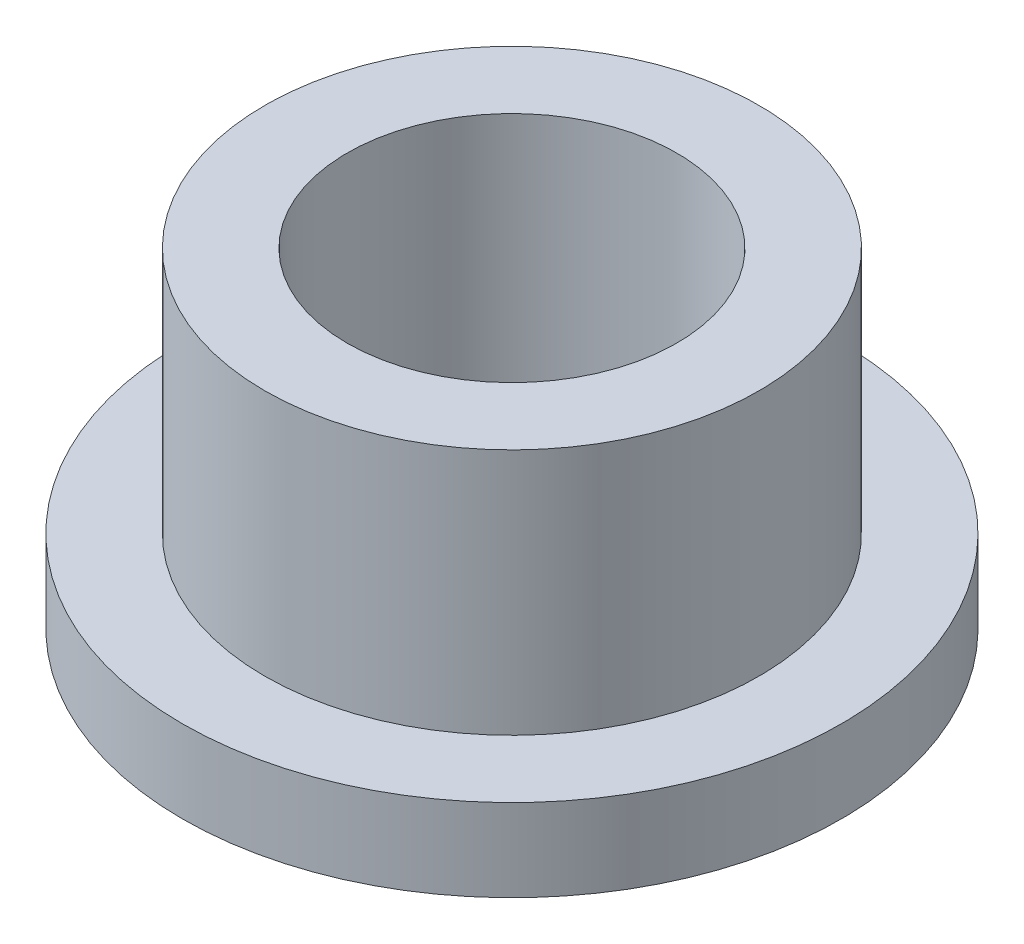
ISO-10303-21;
HEADER;
FILE_DESCRIPTION(('STEP AP214'),'2;1');
FILE_NAME('part.step','',(''),(''),'','','');
FILE_SCHEMA(('AUTOMOTIVE_DESIGN { 1 0 10303 214 1 1 1 1 }'));
ENDSEC;
DATA;
#1=APPLICATION_CONTEXT('core data for automotive mechanical design processes');
#2=APPLICATION_PROTOCOL_DEFINITION('international standard','automotive_design',2000,#1);
#3=PRODUCT_CONTEXT('',#1,'mechanical');
#4=PRODUCT('Part','Part','',(#3));
#5=PRODUCT_RELATED_PRODUCT_CATEGORY('part','',(#4));
#6=PRODUCT_DEFINITION_FORMATION('','',#4);
#7=PRODUCT_DEFINITION_CONTEXT('part definition',#1,'design');
#8=PRODUCT_DEFINITION('design','',#6,#7);
#9=PRODUCT_DEFINITION_SHAPE('','',#8);
#10=(LENGTH_UNIT() NAMED_UNIT(*) SI_UNIT(.MILLI.,.METRE.));
#11=(NAMED_UNIT(*) PLANE_ANGLE_UNIT() SI_UNIT($,.RADIAN.));
#12=(NAMED_UNIT(*) SI_UNIT($,.STERADIAN.) SOLID_ANGLE_UNIT());
#13=UNCERTAINTY_MEASURE_WITH_UNIT(LENGTH_MEASURE(1.E-05),#10,'distance_accuracy_value','');
#14=(GEOMETRIC_REPRESENTATION_CONTEXT(3) GLOBAL_UNCERTAINTY_ASSIGNED_CONTEXT((#13)) GLOBAL_UNIT_ASSIGNED_CONTEXT((#10,
#11,#12)) REPRESENTATION_CONTEXT('',''));
#15=CARTESIAN_POINT('',(0.,0.,0.));
#16=DIRECTION('',(0.,0.,1.));
#17=DIRECTION('',(1.,0.,0.));
#18=AXIS2_PLACEMENT_3D('',#15,#16,#17);
#19=CARTESIAN_POINT('',(0.,3.175,0.));
#20=DIRECTION('',(0.,1.,0.));
#21=DIRECTION('',(0.,0.,1.));
#22=AXIS2_PLACEMENT_3D('',#19,#20,#21);
#23=PLANE('',#22);
#24=CARTESIAN_POINT('',(0.,3.175,0.));
#25=DIRECTION('',(0.,1.,0.));
#26=DIRECTION('',(0.,0.,1.));
#27=AXIS2_PLACEMENT_3D('',#24,#25,#26);
#28=CIRCLE('',#27,12.7);
#29=CARTESIAN_POINT('',(0.,3.175,12.7));
#30=VERTEX_POINT('',#29);
#31=EDGE_CURVE('E11',#30,#30,#28,.T.);
#32=ORIENTED_EDGE('',*,*,#31,.T.);
#33=EDGE_LOOP('',(#32));
#34=FACE_BOUND('',#33,.T.);
#35=CARTESIAN_POINT('',(0.,3.175,0.));
#36=DIRECTION('',(0.,1.,0.));
#37=DIRECTION('',(0.,0.,1.));
#38=AXIS2_PLACEMENT_3D('',#35,#36,#37);
#39=CIRCLE('',#38,9.525);
#40=CARTESIAN_POINT('',(0.,3.175,9.525));
#41=VERTEX_POINT('',#40);
#42=EDGE_CURVE('E47',#41,#41,#39,.T.);
#43=ORIENTED_EDGE('',*,*,#42,.F.);
#44=EDGE_LOOP('',(#43));
#45=FACE_BOUND('',#44,.T.);
#46=ADVANCED_FACE('F32',(#34,#45),#23,.T.);
#47=CARTESIAN_POINT('',(0.,3.175,0.));
#48=DIRECTION('',(0.,-1.,0.));
#49=DIRECTION('',(0.,0.,-1.));
#50=AXIS2_PLACEMENT_3D('',#47,#48,#49);
#51=CYLINDRICAL_SURFACE('',#50,12.7);
#52=ORIENTED_EDGE('',*,*,#31,.F.);
#53=EDGE_LOOP('',(#52));
#54=FACE_BOUND('',#53,.T.);
#55=CARTESIAN_POINT('',(0.,0.,0.));
#56=DIRECTION('',(0.,1.,0.));
#57=DIRECTION('',(0.,0.,1.));
#58=AXIS2_PLACEMENT_3D('',#55,#56,#57);
#59=CIRCLE('',#58,12.7);
#60=CARTESIAN_POINT('',(0.,0.,12.7));
#61=VERTEX_POINT('',#60);
#62=EDGE_CURVE('E36',#61,#61,#59,.T.);
#63=ORIENTED_EDGE('',*,*,#62,.T.);
#64=EDGE_LOOP('',(#63));
#65=FACE_BOUND('',#64,.T.);
#66=ADVANCED_FACE('F34',(#54,#65),#51,.T.);
#67=CARTESIAN_POINT('',(0.,0.,0.));
#68=DIRECTION('',(0.,1.,0.));
#69=DIRECTION('',(0.,0.,1.));
#70=AXIS2_PLACEMENT_3D('',#67,#68,#69);
#71=PLANE('',#70);
#72=CARTESIAN_POINT('',(0.,0.,0.));
#73=DIRECTION('',(0.,1.,0.));
#74=DIRECTION('',(0.,0.,1.));
#75=AXIS2_PLACEMENT_3D('',#72,#73,#74);
#76=CIRCLE('',#75,6.35);
#77=CARTESIAN_POINT('',(0.,0.,6.35));
#78=VERTEX_POINT('',#77);
#79=EDGE_CURVE('E50',#78,#78,#76,.T.);
#80=ORIENTED_EDGE('',*,*,#79,.T.);
#81=EDGE_LOOP('',(#80));
#82=FACE_BOUND('',#81,.T.);
#83=ORIENTED_EDGE('',*,*,#62,.F.);
#84=EDGE_LOOP('',(#83));
#85=FACE_BOUND('',#84,.T.);
#86=ADVANCED_FACE('F57',(#82,#85),#71,.F.);
#87=CARTESIAN_POINT('',(0.,52.3407683632075,0.));
#88=DIRECTION('',(0.,-1.,0.));
#89=DIRECTION('',(0.,0.,-1.));
#90=AXIS2_PLACEMENT_3D('',#87,#88,#89);
#91=CYLINDRICAL_SURFACE('',#90,9.525);
#92=ORIENTED_EDGE('',*,*,#42,.T.);
#93=EDGE_LOOP('',(#92));
#94=FACE_BOUND('',#93,.T.);
#95=CARTESIAN_POINT('',(0.,12.7,0.));
#96=DIRECTION('',(0.,1.,0.));
#97=DIRECTION('',(0.,0.,1.));
#98=AXIS2_PLACEMENT_3D('',#95,#96,#97);
#99=CIRCLE('',#98,9.525);
#100=CARTESIAN_POINT('',(0.,12.7,9.525));
#101=VERTEX_POINT('',#100);
#102=EDGE_CURVE('E43',#101,#101,#99,.T.);
#103=ORIENTED_EDGE('',*,*,#102,.F.);
#104=EDGE_LOOP('',(#103));
#105=FACE_BOUND('',#104,.T.);
#106=ADVANCED_FACE('F69',(#94,#105),#91,.T.);
#107=CARTESIAN_POINT('',(0.,12.7,0.));
#108=DIRECTION('',(0.,1.,0.));
#109=DIRECTION('',(0.,0.,1.));
#110=AXIS2_PLACEMENT_3D('',#107,#108,#109);
#111=PLANE('',#110);
#112=CARTESIAN_POINT('',(0.,12.7,0.));
#113=DIRECTION('',(0.,1.,0.));
#114=DIRECTION('',(0.,0.,1.));
#115=AXIS2_PLACEMENT_3D('',#112,#113,#114);
#116=CIRCLE('',#115,6.35);
#117=CARTESIAN_POINT('',(0.,12.7,6.35));
#118=VERTEX_POINT('',#117);
#119=EDGE_CURVE('E51',#118,#118,#116,.T.);
#120=ORIENTED_EDGE('',*,*,#119,.F.);
#121=EDGE_LOOP('',(#120));
#122=FACE_BOUND('',#121,.T.);
#123=ORIENTED_EDGE('',*,*,#102,.T.);
#124=EDGE_LOOP('',(#123));
#125=FACE_BOUND('',#124,.T.);
#126=ADVANCED_FACE('F63',(#122,#125),#111,.T.);
#127=CARTESIAN_POINT('',(0.,0.,0.));
#128=DIRECTION('',(0.,1.,0.));
#129=DIRECTION('',(0.,0.,1.));
#130=AXIS2_PLACEMENT_3D('',#127,#128,#129);
#131=CYLINDRICAL_SURFACE('',#130,6.35);
#132=ORIENTED_EDGE('',*,*,#79,.F.);
#133=EDGE_LOOP('',(#132));
#134=FACE_BOUND('',#133,.T.);
#135=ORIENTED_EDGE('',*,*,#119,.T.);
#136=EDGE_LOOP('',(#135));
#137=FACE_BOUND('',#136,.T.);
#138=ADVANCED_FACE('F60',(#134,#137),#131,.F.);
#139=CLOSED_SHELL('',(#46,#66,#86,#106,#126,#138));
#140=MANIFOLD_SOLID_BREP('B2',#139);
#141=ADVANCED_BREP_SHAPE_REPRESENTATION('',(#18,#140),#14);
#142=SHAPE_DEFINITION_REPRESENTATION(#9,#141);
ENDSEC;
END-ISO-10303-21;
